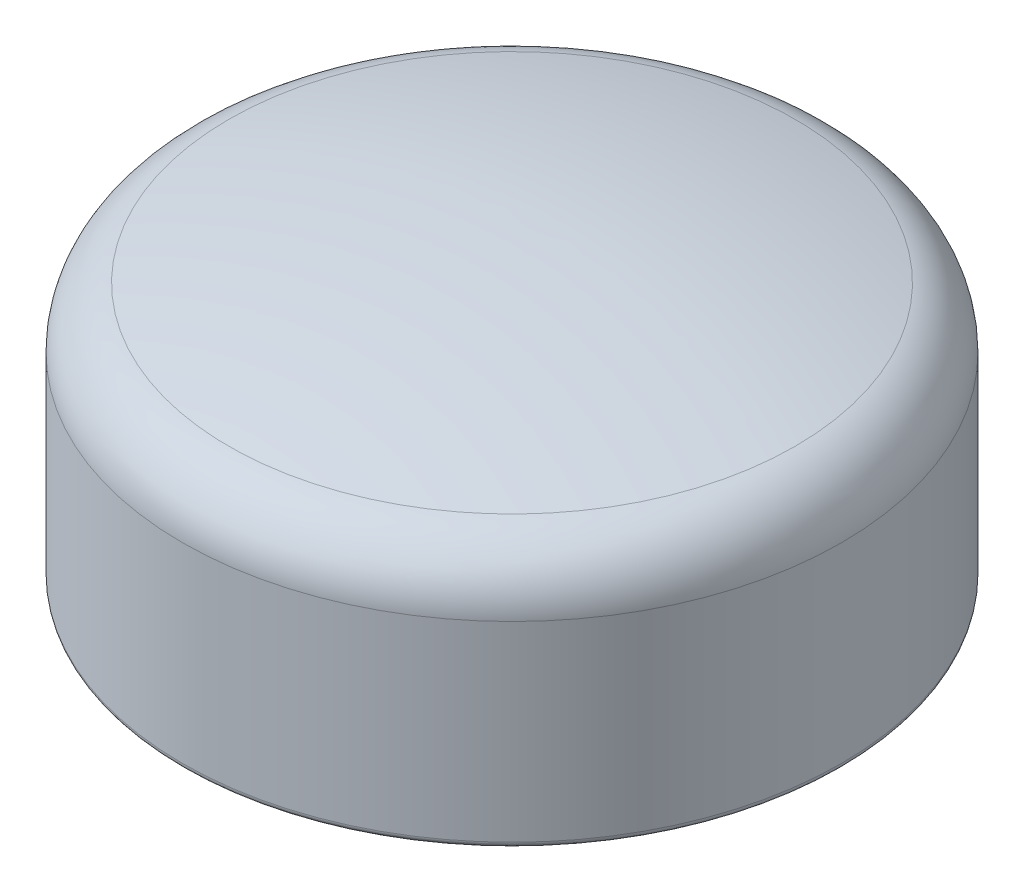
ISO-10303-21;
HEADER;
FILE_DESCRIPTION(('STEP AP214'),'2;1');
FILE_NAME('part.step','',(''),(''),'','','');
FILE_SCHEMA(('AUTOMOTIVE_DESIGN { 1 0 10303 214 1 1 1 1 }'));
ENDSEC;
DATA;
#1=APPLICATION_CONTEXT('core data for automotive mechanical design processes');
#2=APPLICATION_PROTOCOL_DEFINITION('international standard','automotive_design',2000,#1);
#3=PRODUCT_CONTEXT('',#1,'mechanical');
#4=PRODUCT('Part','Part','',(#3));
#5=PRODUCT_RELATED_PRODUCT_CATEGORY('part','',(#4));
#6=PRODUCT_DEFINITION_FORMATION('','',#4);
#7=PRODUCT_DEFINITION_CONTEXT('part definition',#1,'design');
#8=PRODUCT_DEFINITION('design','',#6,#7);
#9=PRODUCT_DEFINITION_SHAPE('','',#8);
#10=(LENGTH_UNIT() NAMED_UNIT(*) SI_UNIT(.MILLI.,.METRE.));
#11=(NAMED_UNIT(*) PLANE_ANGLE_UNIT() SI_UNIT($,.RADIAN.));
#12=(NAMED_UNIT(*) SI_UNIT($,.STERADIAN.) SOLID_ANGLE_UNIT());
#13=UNCERTAINTY_MEASURE_WITH_UNIT(LENGTH_MEASURE(1.E-05),#10,'distance_accuracy_value','');
#14=(GEOMETRIC_REPRESENTATION_CONTEXT(3) GLOBAL_UNCERTAINTY_ASSIGNED_CONTEXT((#13)) GLOBAL_UNIT_ASSIGNED_CONTEXT((#10,
#11,#12)) REPRESENTATION_CONTEXT('',''));
#15=CARTESIAN_POINT('',(0.,0.,0.));
#16=DIRECTION('',(0.,0.,1.));
#17=DIRECTION('',(1.,0.,0.));
#18=AXIS2_PLACEMENT_3D('',#15,#16,#17);
#19=CARTESIAN_POINT('',(0.,-32.7488460701122,0.));
#20=DIRECTION('',(0.,-1.,0.));
#21=DIRECTION('',(1.,0.,0.));
#22=AXIS2_PLACEMENT_3D('',#19,#20,#21);
#23=SPHERICAL_SURFACE('',#22,44.8298320354443);
#24=CARTESIAN_POINT('',(0.,10.5534464811244,0.));
#25=DIRECTION('',(0.,-1.,0.));
#26=DIRECTION('',(1.,0.,0.));
#27=AXIS2_PLACEMENT_3D('',#24,#25,#26);
#28=CIRCLE('',#27,11.6028143195202);
#29=CARTESIAN_POINT('',(11.6028143195201,10.5534464811245,0.));
#30=VERTEX_POINT('',#29);
#31=EDGE_CURVE('E61',#30,#30,#28,.T.);
#32=ORIENTED_EDGE('',*,*,#31,.F.);
#33=EDGE_LOOP('',(#32));
#34=FACE_BOUND('',#33,.T.);
#35=ADVANCED_FACE('F32',(#34),#23,.T.);
#36=CARTESIAN_POINT('',(0.,-32.7488460701122,0.));
#37=DIRECTION('',(0.,-1.,0.));
#38=DIRECTION('',(1.,0.,0.));
#39=AXIS2_PLACEMENT_3D('',#36,#37,#38);
#40=SPHERICAL_SURFACE('',#39,43.8298320354443);
#41=CARTESIAN_POINT('',(0.,9.58752065483537,0.));
#42=DIRECTION('',(0.,-1.,0.));
#43=DIRECTION('',(1.,0.,0.));
#44=AXIS2_PLACEMENT_3D('',#41,#42,#43);
#45=CIRCLE('',#44,11.3439952744176);
#46=CARTESIAN_POINT('',(11.3439952744176,9.58752065483541,0.));
#47=VERTEX_POINT('',#46);
#48=EDGE_CURVE('E52',#47,#47,#45,.T.);
#49=ORIENTED_EDGE('',*,*,#48,.T.);
#50=EDGE_LOOP('',(#49));
#51=FACE_BOUND('',#50,.T.);
#52=ADVANCED_FACE('F69',(#51),#40,.F.);
#53=CARTESIAN_POINT('',(0.,8.08098596533203,0.));
#54=DIRECTION('',(0.,-1.,0.));
#55=DIRECTION('',(1.,0.,0.));
#56=AXIS2_PLACEMENT_3D('',#53,#54,#55);
#57=TOROIDAL_SURFACE('',#56,10.9403205209957,1.55967947900428);
#58=CARTESIAN_POINT('',(0.,8.08098596533202,0.));
#59=DIRECTION('',(0.,-1.,0.));
#60=DIRECTION('',(1.,0.,0.));
#61=AXIS2_PLACEMENT_3D('',#58,#59,#60);
#62=CIRCLE('',#61,12.5);
#63=CARTESIAN_POINT('',(12.5,8.08098596533207,0.));
#64=VERTEX_POINT('',#63);
#65=EDGE_CURVE('E55',#64,#64,#62,.T.);
#66=ORIENTED_EDGE('',*,*,#65,.T.);
#67=EDGE_LOOP('',(#66));
#68=FACE_BOUND('',#67,.T.);
#69=ORIENTED_EDGE('',*,*,#48,.F.);
#70=EDGE_LOOP('',(#69));
#71=FACE_BOUND('',#70,.T.);
#72=ADVANCED_FACE('F74',(#68,#71),#57,.F.);
#73=CARTESIAN_POINT('',(9.6675582602626E-13,-281.832551030636,0.));
#74=DIRECTION('',(0.,-1.,0.));
#75=DIRECTION('',(1.,0.,0.));
#76=AXIS2_PLACEMENT_3D('',#73,#74,#75);
#77=CYLINDRICAL_SURFACE('',#76,12.5);
#78=CARTESIAN_POINT('',(0.,0.249999999999972,0.));
#79=DIRECTION('',(0.,-1.,0.));
#80=DIRECTION('',(1.,0.,0.));
#81=AXIS2_PLACEMENT_3D('',#78,#79,#80);
#82=CIRCLE('',#81,12.5);
#83=CARTESIAN_POINT('',(12.5,0.250000000000015,0.));
#84=VERTEX_POINT('',#83);
#85=EDGE_CURVE('E47',#84,#84,#82,.T.);
#86=ORIENTED_EDGE('',*,*,#85,.T.);
#87=EDGE_LOOP('',(#86));
#88=FACE_BOUND('',#87,.T.);
#89=ORIENTED_EDGE('',*,*,#65,.F.);
#90=EDGE_LOOP('',(#89));
#91=FACE_BOUND('',#90,.T.);
#92=ADVANCED_FACE('F91',(#88,#91),#77,.F.);
#93=CARTESIAN_POINT('',(13.5,0.,0.));
#94=DIRECTION('',(0.,-1.,0.));
#95=DIRECTION('',(1.,0.,0.));
#96=AXIS2_PLACEMENT_3D('',#93,#94,#95);
#97=PLANE('',#96);
#98=CARTESIAN_POINT('',(0.,0.,0.));
#99=DIRECTION('',(0.,-1.,0.));
#100=DIRECTION('',(1.,0.,0.));
#101=AXIS2_PLACEMENT_3D('',#98,#99,#100);
#102=CIRCLE('',#101,12.75);
#103=CARTESIAN_POINT('',(12.75,0.,0.));
#104=VERTEX_POINT('',#103);
#105=EDGE_CURVE('E39',#104,#104,#102,.F.);
#106=ORIENTED_EDGE('',*,*,#105,.T.);
#107=EDGE_LOOP('',(#106));
#108=FACE_BOUND('',#107,.T.);
#109=CARTESIAN_POINT('',(0.,0.,0.));
#110=DIRECTION('',(0.,-1.,0.));
#111=DIRECTION('',(1.,0.,0.));
#112=AXIS2_PLACEMENT_3D('',#109,#110,#111);
#113=CIRCLE('',#112,13.25);
#114=CARTESIAN_POINT('',(13.25,0.,0.));
#115=VERTEX_POINT('',#114);
#116=EDGE_CURVE('E43',#115,#115,#113,.T.);
#117=ORIENTED_EDGE('',*,*,#116,.T.);
#118=EDGE_LOOP('',(#117));
#119=FACE_BOUND('',#118,.T.);
#120=ADVANCED_FACE('F94',(#108,#119),#97,.T.);
#121=CARTESIAN_POINT('',(9.6675582602626E-13,-281.832551030636,0.));
#122=DIRECTION('',(0.,-1.,0.));
#123=DIRECTION('',(1.,0.,0.));
#124=AXIS2_PLACEMENT_3D('',#121,#122,#123);
#125=CYLINDRICAL_SURFACE('',#124,13.5);
#126=CARTESIAN_POINT('',(0.,0.249999999999972,0.));
#127=DIRECTION('',(0.,-1.,0.));
#128=DIRECTION('',(1.,0.,0.));
#129=AXIS2_PLACEMENT_3D('',#126,#127,#128);
#130=CIRCLE('',#129,13.5);
#131=CARTESIAN_POINT('',(13.5,0.250000000000019,0.));
#132=VERTEX_POINT('',#131);
#133=EDGE_CURVE('E10',#132,#132,#130,.F.);
#134=ORIENTED_EDGE('',*,*,#133,.T.);
#135=EDGE_LOOP('',(#134));
#136=FACE_BOUND('',#135,.T.);
#137=CARTESIAN_POINT('',(0.,8.08098596533202,0.));
#138=DIRECTION('',(0.,-1.,0.));
#139=DIRECTION('',(1.,0.,0.));
#140=AXIS2_PLACEMENT_3D('',#137,#138,#139);
#141=CIRCLE('',#140,13.5);
#142=CARTESIAN_POINT('',(13.5,8.08098596533207,0.));
#143=VERTEX_POINT('',#142);
#144=EDGE_CURVE('E58',#143,#143,#141,.T.);
#145=ORIENTED_EDGE('',*,*,#144,.T.);
#146=EDGE_LOOP('',(#145));
#147=FACE_BOUND('',#146,.T.);
#148=ADVANCED_FACE('F86',(#136,#147),#125,.T.);
#149=CARTESIAN_POINT('',(0.,8.08098596533202,0.));
#150=DIRECTION('',(0.,-1.,0.));
#151=DIRECTION('',(1.,0.,0.));
#152=AXIS2_PLACEMENT_3D('',#149,#150,#151);
#153=TOROIDAL_SURFACE('',#152,10.9403205209957,2.5596794790043);
#154=ORIENTED_EDGE('',*,*,#31,.T.);
#155=EDGE_LOOP('',(#154));
#156=FACE_BOUND('',#155,.T.);
#157=ORIENTED_EDGE('',*,*,#144,.F.);
#158=EDGE_LOOP('',(#157));
#159=FACE_BOUND('',#158,.T.);
#160=ADVANCED_FACE('F65',(#156,#159),#153,.T.);
#161=CARTESIAN_POINT('',(0.,0.249999999999972,0.));
#162=DIRECTION('',(0.,-1.,0.));
#163=DIRECTION('',(1.,0.,0.));
#164=AXIS2_PLACEMENT_3D('',#161,#162,#163);
#165=TOROIDAL_SURFACE('',#164,12.75,0.25);
#166=ORIENTED_EDGE('',*,*,#105,.F.);
#167=EDGE_LOOP('',(#166));
#168=FACE_BOUND('',#167,.T.);
#169=ORIENTED_EDGE('',*,*,#85,.F.);
#170=EDGE_LOOP('',(#169));
#171=FACE_BOUND('',#170,.T.);
#172=ADVANCED_FACE('F78',(#168,#171),#165,.T.);
#173=CARTESIAN_POINT('',(0.,0.249999999999972,0.));
#174=DIRECTION('',(0.,-1.,0.));
#175=DIRECTION('',(1.,0.,0.));
#176=AXIS2_PLACEMENT_3D('',#173,#174,#175);
#177=TOROIDAL_SURFACE('',#176,13.25,0.25);
#178=ORIENTED_EDGE('',*,*,#133,.F.);
#179=EDGE_LOOP('',(#178));
#180=FACE_BOUND('',#179,.T.);
#181=ORIENTED_EDGE('',*,*,#116,.F.);
#182=EDGE_LOOP('',(#181));
#183=FACE_BOUND('',#182,.T.);
#184=ADVANCED_FACE('F34',(#180,#183),#177,.T.);
#185=CLOSED_SHELL('',(#35,#52,#72,#92,#120,#148,#160,#172,#184));
#186=MANIFOLD_SOLID_BREP('B2',#185);
#187=ADVANCED_BREP_SHAPE_REPRESENTATION('',(#18,#186),#14);
#188=SHAPE_DEFINITION_REPRESENTATION(#9,#187);
ENDSEC;
END-ISO-10303-21;
